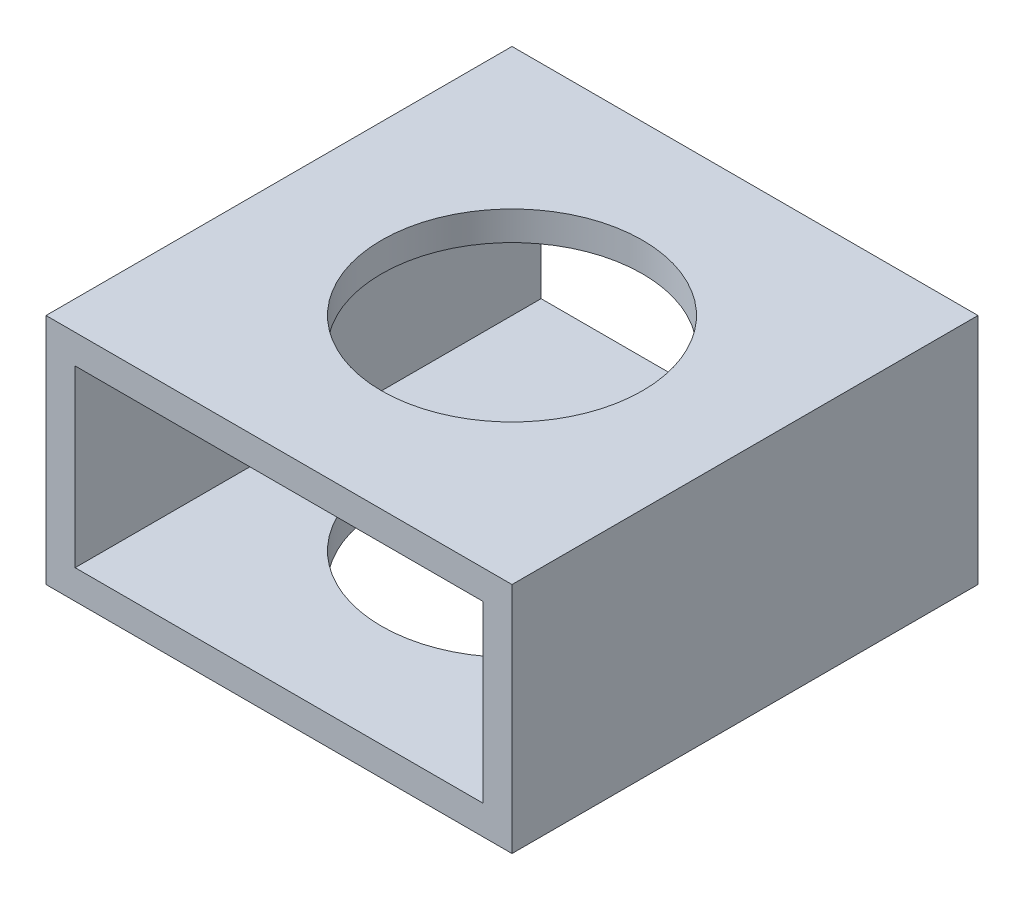
ISO-10303-21;
HEADER;
FILE_DESCRIPTION(('STEP AP214'),'2;1');
FILE_NAME('part.step','',(''),(''),'','','');
FILE_SCHEMA(('AUTOMOTIVE_DESIGN { 1 0 10303 214 1 1 1 1 }'));
ENDSEC;
DATA;
#1=APPLICATION_CONTEXT('core data for automotive mechanical design processes');
#2=APPLICATION_PROTOCOL_DEFINITION('international standard','automotive_design',2000,#1);
#3=PRODUCT_CONTEXT('',#1,'mechanical');
#4=PRODUCT('Part','Part','',(#3));
#5=PRODUCT_RELATED_PRODUCT_CATEGORY('part','',(#4));
#6=PRODUCT_DEFINITION_FORMATION('','',#4);
#7=PRODUCT_DEFINITION_CONTEXT('part definition',#1,'design');
#8=PRODUCT_DEFINITION('design','',#6,#7);
#9=PRODUCT_DEFINITION_SHAPE('','',#8);
#10=(LENGTH_UNIT() NAMED_UNIT(*) SI_UNIT(.MILLI.,.METRE.));
#11=(NAMED_UNIT(*) PLANE_ANGLE_UNIT() SI_UNIT($,.RADIAN.));
#12=(NAMED_UNIT(*) SI_UNIT($,.STERADIAN.) SOLID_ANGLE_UNIT());
#13=UNCERTAINTY_MEASURE_WITH_UNIT(LENGTH_MEASURE(1.E-05),#10,'distance_accuracy_value','');
#14=(GEOMETRIC_REPRESENTATION_CONTEXT(3) GLOBAL_UNCERTAINTY_ASSIGNED_CONTEXT((#13)) GLOBAL_UNIT_ASSIGNED_CONTEXT((#10,
#11,#12)) REPRESENTATION_CONTEXT('',''));
#15=CARTESIAN_POINT('',(0.,0.,0.));
#16=DIRECTION('',(0.,0.,1.));
#17=DIRECTION('',(1.,0.,0.));
#18=AXIS2_PLACEMENT_3D('',#15,#16,#17);
#19=CARTESIAN_POINT('',(0.,0.,50.8));
#20=DIRECTION('',(0.,0.,-1.));
#21=DIRECTION('',(-1.,0.,0.));
#22=AXIS2_PLACEMENT_3D('',#19,#20,#21);
#23=PLANE('',#22);
#24=DIRECTION('',(0.,-1.,0.));
#25=VECTOR('',#24,1.);
#26=CARTESIAN_POINT('',(0.,0.,50.8));
#27=LINE('',#26,#25);
#28=CARTESIAN_POINT('',(0.,25.4,50.8));
#29=VERTEX_POINT('',#28);
#30=CARTESIAN_POINT('',(0.,0.,50.8));
#31=VERTEX_POINT('',#30);
#32=EDGE_CURVE('E137',#29,#31,#27,.T.);
#33=ORIENTED_EDGE('',*,*,#32,.T.);
#34=DIRECTION('',(1.,0.,0.));
#35=VECTOR('',#34,1.);
#36=CARTESIAN_POINT('',(0.,0.,50.8));
#37=LINE('',#36,#35);
#38=CARTESIAN_POINT('',(50.8,0.,50.8));
#39=VERTEX_POINT('',#38);
#40=EDGE_CURVE('E140',#31,#39,#37,.T.);
#41=ORIENTED_EDGE('',*,*,#40,.T.);
#42=DIRECTION('',(0.,1.,0.));
#43=VECTOR('',#42,1.);
#44=CARTESIAN_POINT('',(50.8,0.,50.8));
#45=LINE('',#44,#43);
#46=CARTESIAN_POINT('',(50.8,25.4,50.8));
#47=VERTEX_POINT('',#46);
#48=EDGE_CURVE('E143',#39,#47,#45,.T.);
#49=ORIENTED_EDGE('',*,*,#48,.T.);
#50=DIRECTION('',(-1.,0.,0.));
#51=VECTOR('',#50,1.);
#52=CARTESIAN_POINT('',(0.,25.4,50.8));
#53=LINE('',#52,#51);
#54=EDGE_CURVE('E145',#47,#29,#53,.T.);
#55=ORIENTED_EDGE('',*,*,#54,.T.);
#56=EDGE_LOOP('',(#33,#41,#49,#55));
#57=FACE_BOUND('',#56,.T.);
#58=DIRECTION('',(1.,0.,0.));
#59=VECTOR('',#58,1.);
#60=CARTESIAN_POINT('',(3.175,3.175,50.8));
#61=LINE('',#60,#59);
#62=CARTESIAN_POINT('',(3.175,3.175,50.8));
#63=VERTEX_POINT('',#62);
#64=CARTESIAN_POINT('',(47.625,3.175,50.8));
#65=VERTEX_POINT('',#64);
#66=EDGE_CURVE('E99',#63,#65,#61,.T.);
#67=ORIENTED_EDGE('',*,*,#66,.F.);
#68=DIRECTION('',(0.,-1.,0.));
#69=VECTOR('',#68,1.);
#70=CARTESIAN_POINT('',(3.175,3.175,50.8));
#71=LINE('',#70,#69);
#72=CARTESIAN_POINT('',(3.175,22.225,50.8));
#73=VERTEX_POINT('',#72);
#74=EDGE_CURVE('E121',#73,#63,#71,.T.);
#75=ORIENTED_EDGE('',*,*,#74,.F.);
#76=DIRECTION('',(-1.,0.,0.));
#77=VECTOR('',#76,1.);
#78=CARTESIAN_POINT('',(3.175,22.225,50.8));
#79=LINE('',#78,#77);
#80=CARTESIAN_POINT('',(47.625,22.225,50.8));
#81=VERTEX_POINT('',#80);
#82=EDGE_CURVE('E119',#81,#73,#79,.T.);
#83=ORIENTED_EDGE('',*,*,#82,.F.);
#84=DIRECTION('',(0.,1.,0.));
#85=VECTOR('',#84,1.);
#86=CARTESIAN_POINT('',(47.625,3.175,50.8));
#87=LINE('',#86,#85);
#88=EDGE_CURVE('E107',#65,#81,#87,.T.);
#89=ORIENTED_EDGE('',*,*,#88,.F.);
#90=EDGE_LOOP('',(#67,#75,#83,#89));
#91=FACE_BOUND('',#90,.T.);
#92=ADVANCED_FACE('F33',(#57,#91),#23,.F.);
#93=CARTESIAN_POINT('',(0.,0.,0.));
#94=DIRECTION('',(0.,0.,-1.));
#95=DIRECTION('',(-1.,0.,0.));
#96=AXIS2_PLACEMENT_3D('',#93,#94,#95);
#97=PLANE('',#96);
#98=DIRECTION('',(0.,-1.,0.));
#99=VECTOR('',#98,1.);
#100=CARTESIAN_POINT('',(0.,0.,0.));
#101=LINE('',#100,#99);
#102=CARTESIAN_POINT('',(0.,25.4,0.));
#103=VERTEX_POINT('',#102);
#104=CARTESIAN_POINT('',(0.,0.,0.));
#105=VERTEX_POINT('',#104);
#106=EDGE_CURVE('E115',#103,#105,#101,.T.);
#107=ORIENTED_EDGE('',*,*,#106,.F.);
#108=DIRECTION('',(-1.,0.,0.));
#109=VECTOR('',#108,1.);
#110=CARTESIAN_POINT('',(0.,25.4,0.));
#111=LINE('',#110,#109);
#112=CARTESIAN_POINT('',(50.8,25.4,0.));
#113=VERTEX_POINT('',#112);
#114=EDGE_CURVE('E141',#113,#103,#111,.T.);
#115=ORIENTED_EDGE('',*,*,#114,.F.);
#116=DIRECTION('',(0.,1.,0.));
#117=VECTOR('',#116,1.);
#118=CARTESIAN_POINT('',(50.8,0.,0.));
#119=LINE('',#118,#117);
#120=CARTESIAN_POINT('',(50.8,0.,0.));
#121=VERTEX_POINT('',#120);
#122=EDGE_CURVE('E152',#121,#113,#119,.T.);
#123=ORIENTED_EDGE('',*,*,#122,.F.);
#124=DIRECTION('',(1.,0.,0.));
#125=VECTOR('',#124,1.);
#126=CARTESIAN_POINT('',(0.,0.,0.));
#127=LINE('',#126,#125);
#128=EDGE_CURVE('E150',#105,#121,#127,.T.);
#129=ORIENTED_EDGE('',*,*,#128,.F.);
#130=EDGE_LOOP('',(#107,#115,#123,#129));
#131=FACE_BOUND('',#130,.T.);
#132=DIRECTION('',(0.,-1.,0.));
#133=VECTOR('',#132,1.);
#134=CARTESIAN_POINT('',(3.175,3.175,0.));
#135=LINE('',#134,#133);
#136=CARTESIAN_POINT('',(3.175,22.225,0.));
#137=VERTEX_POINT('',#136);
#138=CARTESIAN_POINT('',(3.175,3.175,0.));
#139=VERTEX_POINT('',#138);
#140=EDGE_CURVE('E108',#137,#139,#135,.T.);
#141=ORIENTED_EDGE('',*,*,#140,.T.);
#142=DIRECTION('',(1.,0.,0.));
#143=VECTOR('',#142,1.);
#144=CARTESIAN_POINT('',(3.175,3.175,0.));
#145=LINE('',#144,#143);
#146=CARTESIAN_POINT('',(47.625,3.175,0.));
#147=VERTEX_POINT('',#146);
#148=EDGE_CURVE('E57',#139,#147,#145,.T.);
#149=ORIENTED_EDGE('',*,*,#148,.T.);
#150=DIRECTION('',(0.,1.,0.));
#151=VECTOR('',#150,1.);
#152=CARTESIAN_POINT('',(47.625,3.175,0.));
#153=LINE('',#152,#151);
#154=CARTESIAN_POINT('',(47.625,22.225,0.));
#155=VERTEX_POINT('',#154);
#156=EDGE_CURVE('E114',#147,#155,#153,.T.);
#157=ORIENTED_EDGE('',*,*,#156,.T.);
#158=DIRECTION('',(-1.,0.,0.));
#159=VECTOR('',#158,1.);
#160=CARTESIAN_POINT('',(3.175,22.225,0.));
#161=LINE('',#160,#159);
#162=EDGE_CURVE('E129',#155,#137,#161,.T.);
#163=ORIENTED_EDGE('',*,*,#162,.T.);
#164=EDGE_LOOP('',(#141,#149,#157,#163));
#165=FACE_BOUND('',#164,.T.);
#166=ADVANCED_FACE('F171',(#131,#165),#97,.T.);
#167=CARTESIAN_POINT('',(0.,0.,50.8));
#168=DIRECTION('',(1.,0.,0.));
#169=DIRECTION('',(0.,0.,-1.));
#170=AXIS2_PLACEMENT_3D('',#167,#168,#169);
#171=PLANE('',#170);
#172=ORIENTED_EDGE('',*,*,#106,.T.);
#173=DIRECTION('',(0.,0.,-1.));
#174=VECTOR('',#173,1.);
#175=CARTESIAN_POINT('',(0.,0.,50.8));
#176=LINE('',#175,#174);
#177=EDGE_CURVE('E11',#31,#105,#176,.T.);
#178=ORIENTED_EDGE('',*,*,#177,.F.);
#179=ORIENTED_EDGE('',*,*,#32,.F.);
#180=DIRECTION('',(0.,0.,-1.));
#181=VECTOR('',#180,1.);
#182=CARTESIAN_POINT('',(0.,25.4,50.8));
#183=LINE('',#182,#181);
#184=EDGE_CURVE('E147',#29,#103,#183,.T.);
#185=ORIENTED_EDGE('',*,*,#184,.T.);
#186=EDGE_LOOP('',(#172,#178,#179,#185));
#187=FACE_BOUND('',#186,.T.);
#188=ADVANCED_FACE('F35',(#187),#171,.F.);
#189=CARTESIAN_POINT('',(0.,0.,50.8));
#190=DIRECTION('',(0.,1.,0.));
#191=DIRECTION('',(0.,0.,1.));
#192=AXIS2_PLACEMENT_3D('',#189,#190,#191);
#193=PLANE('',#192);
#194=CARTESIAN_POINT('',(25.4,0.,25.4));
#195=DIRECTION('',(0.,1.,0.));
#196=DIRECTION('',(0.,0.,1.));
#197=AXIS2_PLACEMENT_3D('',#194,#195,#196);
#198=CIRCLE('',#197,14.224);
#199=CARTESIAN_POINT('',(25.4,0.,39.624));
#200=VERTEX_POINT('',#199);
#201=EDGE_CURVE('E209',#200,#200,#198,.T.);
#202=ORIENTED_EDGE('',*,*,#201,.T.);
#203=EDGE_LOOP('',(#202));
#204=FACE_BOUND('',#203,.T.);
#205=ORIENTED_EDGE('',*,*,#128,.T.);
#206=DIRECTION('',(0.,0.,-1.));
#207=VECTOR('',#206,1.);
#208=CARTESIAN_POINT('',(50.8,0.,50.8));
#209=LINE('',#208,#207);
#210=EDGE_CURVE('E42',#39,#121,#209,.T.);
#211=ORIENTED_EDGE('',*,*,#210,.F.);
#212=ORIENTED_EDGE('',*,*,#40,.F.);
#213=ORIENTED_EDGE('',*,*,#177,.T.);
#214=EDGE_LOOP('',(#205,#211,#212,#213));
#215=FACE_BOUND('',#214,.T.);
#216=ADVANCED_FACE('F181',(#204,#215),#193,.F.);
#217=CARTESIAN_POINT('',(50.8,0.,50.8));
#218=DIRECTION('',(-1.,0.,0.));
#219=DIRECTION('',(0.,0.,1.));
#220=AXIS2_PLACEMENT_3D('',#217,#218,#219);
#221=PLANE('',#220);
#222=ORIENTED_EDGE('',*,*,#122,.T.);
#223=DIRECTION('',(0.,0.,-1.));
#224=VECTOR('',#223,1.);
#225=CARTESIAN_POINT('',(50.8,25.4,50.8));
#226=LINE('',#225,#224);
#227=EDGE_CURVE('E157',#47,#113,#226,.T.);
#228=ORIENTED_EDGE('',*,*,#227,.F.);
#229=ORIENTED_EDGE('',*,*,#48,.F.);
#230=ORIENTED_EDGE('',*,*,#210,.T.);
#231=EDGE_LOOP('',(#222,#228,#229,#230));
#232=FACE_BOUND('',#231,.T.);
#233=ADVANCED_FACE('F165',(#232),#221,.F.);
#234=CARTESIAN_POINT('',(0.,25.4,50.8));
#235=DIRECTION('',(0.,-1.,0.));
#236=DIRECTION('',(0.,0.,-1.));
#237=AXIS2_PLACEMENT_3D('',#234,#235,#236);
#238=PLANE('',#237);
#239=CARTESIAN_POINT('',(25.4,25.4,25.4));
#240=DIRECTION('',(0.,1.,0.));
#241=DIRECTION('',(0.,0.,1.));
#242=AXIS2_PLACEMENT_3D('',#239,#240,#241);
#243=CIRCLE('',#242,14.224);
#244=CARTESIAN_POINT('',(25.4,25.4,39.624));
#245=VERTEX_POINT('',#244);
#246=EDGE_CURVE('E207',#245,#245,#243,.T.);
#247=ORIENTED_EDGE('',*,*,#246,.F.);
#248=EDGE_LOOP('',(#247));
#249=FACE_BOUND('',#248,.T.);
#250=ORIENTED_EDGE('',*,*,#114,.T.);
#251=ORIENTED_EDGE('',*,*,#184,.F.);
#252=ORIENTED_EDGE('',*,*,#54,.F.);
#253=ORIENTED_EDGE('',*,*,#227,.T.);
#254=EDGE_LOOP('',(#250,#251,#252,#253));
#255=FACE_BOUND('',#254,.T.);
#256=ADVANCED_FACE('F175',(#249,#255),#238,.F.);
#257=CARTESIAN_POINT('',(3.175,3.175,50.8));
#258=DIRECTION('',(0.,1.,0.));
#259=DIRECTION('',(0.,0.,1.));
#260=AXIS2_PLACEMENT_3D('',#257,#258,#259);
#261=PLANE('',#260);
#262=CARTESIAN_POINT('',(25.4,3.175,25.4));
#263=DIRECTION('',(0.,1.,0.));
#264=DIRECTION('',(0.,0.,1.));
#265=AXIS2_PLACEMENT_3D('',#262,#263,#264);
#266=CIRCLE('',#265,14.224);
#267=CARTESIAN_POINT('',(25.4,3.175,39.624));
#268=VERTEX_POINT('',#267);
#269=EDGE_CURVE('E127',#268,#268,#266,.T.);
#270=ORIENTED_EDGE('',*,*,#269,.F.);
#271=EDGE_LOOP('',(#270));
#272=FACE_BOUND('',#271,.T.);
#273=ORIENTED_EDGE('',*,*,#148,.F.);
#274=DIRECTION('',(0.,0.,-1.));
#275=VECTOR('',#274,1.);
#276=CARTESIAN_POINT('',(3.175,3.175,50.8));
#277=LINE('',#276,#275);
#278=EDGE_CURVE('E103',#63,#139,#277,.T.);
#279=ORIENTED_EDGE('',*,*,#278,.F.);
#280=ORIENTED_EDGE('',*,*,#66,.T.);
#281=DIRECTION('',(0.,0.,-1.));
#282=VECTOR('',#281,1.);
#283=CARTESIAN_POINT('',(47.625,3.175,50.8));
#284=LINE('',#283,#282);
#285=EDGE_CURVE('E102',#65,#147,#284,.T.);
#286=ORIENTED_EDGE('',*,*,#285,.T.);
#287=EDGE_LOOP('',(#273,#279,#280,#286));
#288=FACE_BOUND('',#287,.T.);
#289=ADVANCED_FACE('F101',(#272,#288),#261,.T.);
#290=CARTESIAN_POINT('',(47.625,3.175,50.8));
#291=DIRECTION('',(-1.,0.,0.));
#292=DIRECTION('',(0.,0.,1.));
#293=AXIS2_PLACEMENT_3D('',#290,#291,#292);
#294=PLANE('',#293);
#295=ORIENTED_EDGE('',*,*,#156,.F.);
#296=ORIENTED_EDGE('',*,*,#285,.F.);
#297=ORIENTED_EDGE('',*,*,#88,.T.);
#298=DIRECTION('',(0.,0.,-1.));
#299=VECTOR('',#298,1.);
#300=CARTESIAN_POINT('',(47.625,22.225,50.8));
#301=LINE('',#300,#299);
#302=EDGE_CURVE('E116',#81,#155,#301,.T.);
#303=ORIENTED_EDGE('',*,*,#302,.T.);
#304=EDGE_LOOP('',(#295,#296,#297,#303));
#305=FACE_BOUND('',#304,.T.);
#306=ADVANCED_FACE('F111',(#305),#294,.T.);
#307=CARTESIAN_POINT('',(3.175,22.225,50.8));
#308=DIRECTION('',(0.,-1.,0.));
#309=DIRECTION('',(0.,0.,-1.));
#310=AXIS2_PLACEMENT_3D('',#307,#308,#309);
#311=PLANE('',#310);
#312=CARTESIAN_POINT('',(25.4,22.225,25.4));
#313=DIRECTION('',(0.,-1.,0.));
#314=DIRECTION('',(0.,0.,-1.));
#315=AXIS2_PLACEMENT_3D('',#312,#313,#314);
#316=CIRCLE('',#315,14.224);
#317=CARTESIAN_POINT('',(25.4,22.225,11.176));
#318=VERTEX_POINT('',#317);
#319=EDGE_CURVE('E37',#318,#318,#316,.T.);
#320=ORIENTED_EDGE('',*,*,#319,.F.);
#321=EDGE_LOOP('',(#320));
#322=FACE_BOUND('',#321,.T.);
#323=ORIENTED_EDGE('',*,*,#162,.F.);
#324=ORIENTED_EDGE('',*,*,#302,.F.);
#325=ORIENTED_EDGE('',*,*,#82,.T.);
#326=DIRECTION('',(0.,0.,-1.));
#327=VECTOR('',#326,1.);
#328=CARTESIAN_POINT('',(3.175,22.225,50.8));
#329=LINE('',#328,#327);
#330=EDGE_CURVE('E49',#73,#137,#329,.T.);
#331=ORIENTED_EDGE('',*,*,#330,.T.);
#332=EDGE_LOOP('',(#323,#324,#325,#331));
#333=FACE_BOUND('',#332,.T.);
#334=ADVANCED_FACE('F220',(#322,#333),#311,.T.);
#335=CARTESIAN_POINT('',(3.175,3.175,50.8));
#336=DIRECTION('',(1.,0.,0.));
#337=DIRECTION('',(0.,0.,-1.));
#338=AXIS2_PLACEMENT_3D('',#335,#336,#337);
#339=PLANE('',#338);
#340=ORIENTED_EDGE('',*,*,#140,.F.);
#341=ORIENTED_EDGE('',*,*,#330,.F.);
#342=ORIENTED_EDGE('',*,*,#74,.T.);
#343=ORIENTED_EDGE('',*,*,#278,.T.);
#344=EDGE_LOOP('',(#340,#341,#342,#343));
#345=FACE_BOUND('',#344,.T.);
#346=ADVANCED_FACE('F223',(#345),#339,.T.);
#347=CARTESIAN_POINT('',(25.4,0.,25.4));
#348=DIRECTION('',(0.,1.,0.));
#349=DIRECTION('',(0.,0.,1.));
#350=AXIS2_PLACEMENT_3D('',#347,#348,#349);
#351=CYLINDRICAL_SURFACE('',#350,14.224);
#352=ORIENTED_EDGE('',*,*,#319,.T.);
#353=EDGE_LOOP('',(#352));
#354=FACE_BOUND('',#353,.T.);
#355=ORIENTED_EDGE('',*,*,#246,.T.);
#356=EDGE_LOOP('',(#355));
#357=FACE_BOUND('',#356,.T.);
#358=ADVANCED_FACE('F218',(#354,#357),#351,.F.);
#359=ORIENTED_EDGE('',*,*,#269,.T.);
#360=EDGE_LOOP('',(#359));
#361=FACE_BOUND('',#360,.T.);
#362=ORIENTED_EDGE('',*,*,#201,.F.);
#363=EDGE_LOOP('',(#362));
#364=FACE_BOUND('',#363,.T.);
#365=ADVANCED_FACE('F231',(#361,#364),#351,.F.);
#366=CLOSED_SHELL('',(#92,#166,#188,#216,#233,#256,#289,#306,#334,#346,#358,#365));
#367=MANIFOLD_SOLID_BREP('B2',#366);
#368=ADVANCED_BREP_SHAPE_REPRESENTATION('',(#18,#367),#14);
#369=SHAPE_DEFINITION_REPRESENTATION(#9,#368);
ENDSEC;
END-ISO-10303-21;
